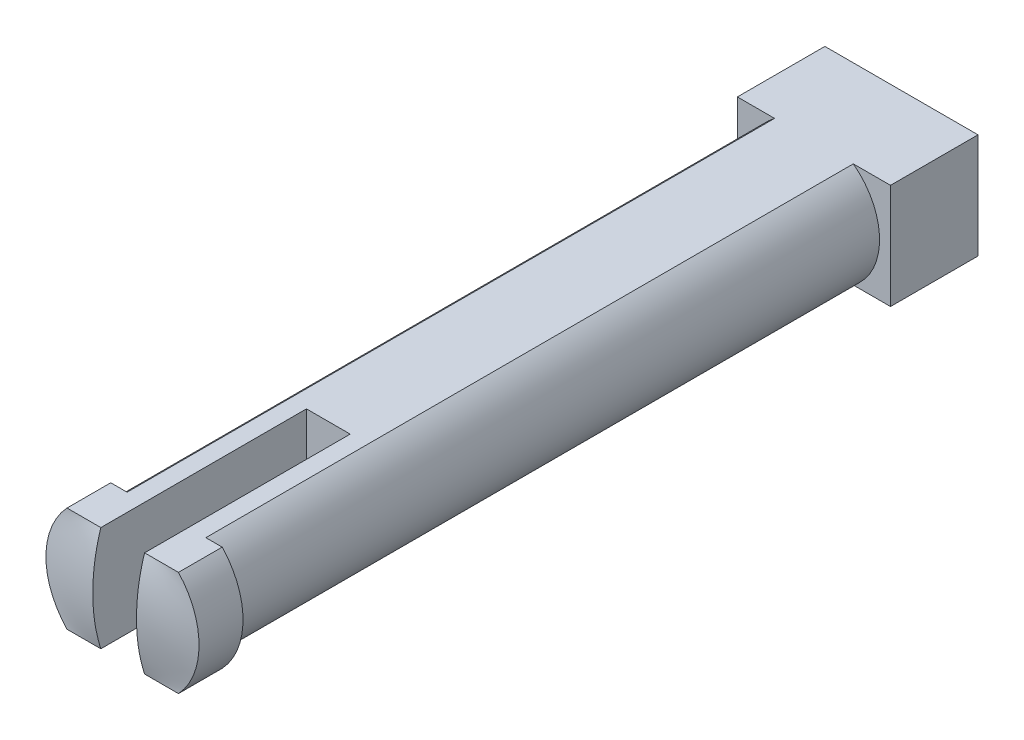
ISO-10303-21;
HEADER;
FILE_DESCRIPTION(('STEP AP214'),'2;1');
FILE_NAME('part.step','',(''),(''),'','','');
FILE_SCHEMA(('AUTOMOTIVE_DESIGN { 1 0 10303 214 1 1 1 1 }'));
ENDSEC;
DATA;
#1=APPLICATION_CONTEXT('core data for automotive mechanical design processes');
#2=APPLICATION_PROTOCOL_DEFINITION('international standard','automotive_design',2000,#1);
#3=PRODUCT_CONTEXT('',#1,'mechanical');
#4=PRODUCT('Part','Part','',(#3));
#5=PRODUCT_RELATED_PRODUCT_CATEGORY('part','',(#4));
#6=PRODUCT_DEFINITION_FORMATION('','',#4);
#7=PRODUCT_DEFINITION_CONTEXT('part definition',#1,'design');
#8=PRODUCT_DEFINITION('design','',#6,#7);
#9=PRODUCT_DEFINITION_SHAPE('','',#8);
#10=(LENGTH_UNIT() NAMED_UNIT(*) SI_UNIT(.MILLI.,.METRE.));
#11=(NAMED_UNIT(*) PLANE_ANGLE_UNIT() SI_UNIT($,.RADIAN.));
#12=(NAMED_UNIT(*) SI_UNIT($,.STERADIAN.) SOLID_ANGLE_UNIT());
#13=UNCERTAINTY_MEASURE_WITH_UNIT(LENGTH_MEASURE(1.E-05),#10,'distance_accuracy_value','');
#14=(GEOMETRIC_REPRESENTATION_CONTEXT(3) GLOBAL_UNCERTAINTY_ASSIGNED_CONTEXT((#13)) GLOBAL_UNIT_ASSIGNED_CONTEXT((#10,
#11,#12)) REPRESENTATION_CONTEXT('',''));
#15=CARTESIAN_POINT('',(0.,0.,0.));
#16=DIRECTION('',(0.,0.,1.));
#17=DIRECTION('',(1.,0.,0.));
#18=AXIS2_PLACEMENT_3D('',#15,#16,#17);
#19=CARTESIAN_POINT('',(-3.23538575752568,3.048,45.212));
#20=CARTESIAN_POINT('',(-4.93756576142003,1.2411729195063,45.212));
#21=CARTESIAN_POINT('',(-4.93756576142003,-1.2411729195063,45.212));
#22=CARTESIAN_POINT('',(-3.23538575752568,-3.048,45.212));
#23=CARTESIAN_POINT('',(-1.07846191917523,3.048,45.212));
#24=CARTESIAN_POINT('',(-1.64585525380668,1.2411729195063,46.1069422487845));
#25=CARTESIAN_POINT('',(-1.64585525380668,-1.2411729195063,46.1069422487845));
#26=CARTESIAN_POINT('',(-1.07846191917522,-3.048,45.212));
#27=CARTESIAN_POINT('',(1.07846191917522,3.048,45.212));
#28=CARTESIAN_POINT('',(1.64585525380668,1.2411729195063,46.1161220234833));
#29=CARTESIAN_POINT('',(1.64585525380668,-1.2411729195063,46.1304379233921));
#30=CARTESIAN_POINT('',(1.07846191917523,-3.048,45.212));
#31=CARTESIAN_POINT('',(3.23538575752567,3.048,45.212));
#32=CARTESIAN_POINT('',(4.93756576142003,1.2411729195063,45.212));
#33=CARTESIAN_POINT('',(4.93756576142003,-1.2411729195063,45.212));
#34=CARTESIAN_POINT('',(3.23538575752568,-3.048,45.212));
#35=B_SPLINE_SURFACE_WITH_KNOTS('',3,3,((#19,#20,#21,#22),(#23,#24,#25,#26),(#27,#28,#29,#30),
(#31,#32,#33,#34)),.UNSPECIFIED.,.F.,.F.,.F.,(4,4),(4,4),(0.,1.),(0.,1.),.UNSPECIFIED.);
#36=CARTESIAN_POINT('',(1.27,-3.048,45.212));
#37=CARTESIAN_POINT('',(1.27,-2.98361809001407,45.2326199668593));
#38=CARTESIAN_POINT('',(1.27,-2.91904839399948,45.25266091532));
#39=CARTESIAN_POINT('',(1.27,-2.78952708008224,45.2914759700286));
#40=CARTESIAN_POINT('',(1.27,-2.72457544801219,45.3102500289565));
#41=CARTESIAN_POINT('',(1.27,-2.59429304450365,45.3464197422777));
#42=CARTESIAN_POINT('',(1.27,-2.52896229852986,45.3638154881264));
#43=CARTESIAN_POINT('',(1.27,-2.39794292194821,45.3971934934623));
#44=CARTESIAN_POINT('',(1.27,-2.33225429646136,45.4131757731191));
#45=CARTESIAN_POINT('',(1.27,-2.13480759934365,45.4589507341408));
#46=CARTESIAN_POINT('',(1.27,-2.00254701375775,45.4866053736012));
#47=CARTESIAN_POINT('',(1.27,-1.73697427102654,45.5362610499949));
#48=CARTESIAN_POINT('',(1.27,-1.60366209596266,45.5582619903765));
#49=CARTESIAN_POINT('',(1.27,-1.33627003341767,45.5967470006934));
#50=CARTESIAN_POINT('',(1.27,-1.20219030398619,45.6132321675849));
#51=CARTESIAN_POINT('',(1.27,-0.933492433428468,45.6408224944221));
#52=CARTESIAN_POINT('',(1.27,-0.798874309185811,45.6519278217616));
#53=CARTESIAN_POINT('',(1.27,-0.394364696478014,45.6773568462903));
#54=CARTESIAN_POINT('',(1.27,-0.123936614210182,45.6837767714445));
#55=CARTESIAN_POINT('',(1.27,0.391924793308638,45.6762233223643));
#56=CARTESIAN_POINT('',(1.27,0.637386975211703,45.6640575217135));
#57=CARTESIAN_POINT('',(1.27,1.00445358419208,45.6327239221487));
#58=CARTESIAN_POINT('',(1.27,1.12663996829209,45.6200956361424));
#59=CARTESIAN_POINT('',(1.27,1.37047617966599,45.5903925576498));
#60=CARTESIAN_POINT('',(1.27,1.49212600998449,45.5733177904277));
#61=CARTESIAN_POINT('',(1.27,1.73488029310616,45.5346052586752));
#62=CARTESIAN_POINT('',(1.27,1.85598368859804,45.5129608597912));
#63=CARTESIAN_POINT('',(1.27,2.09727421384966,45.465047606888));
#64=CARTESIAN_POINT('',(1.27,2.21746133503228,45.4387787096347));
#65=CARTESIAN_POINT('',(1.27,2.45675866229606,45.3816005695613));
#66=CARTESIAN_POINT('',(1.27,2.5758686102808,45.3506902443101));
#67=CARTESIAN_POINT('',(1.27,2.75360135853055,45.3010192607827));
#68=CARTESIAN_POINT('',(1.27,2.8126917744405,45.2839108610813));
#69=CARTESIAN_POINT('',(1.27,2.9305697461784,45.2486871685476));
#70=CARTESIAN_POINT('',(1.27,2.98935731260786,45.2305719112265));
#71=CARTESIAN_POINT('',(1.26999999999999,3.048,45.212));
#72=B_SPLINE_CURVE_WITH_KNOTS('',3,(#36,#37,#38,#39,#40,#41,#42,#43,#44,#45,#46,#47,#48,#49,#50,
#51,#52,#53,#54,#55,#56,#57,#58,#59,#60,#61,#62,#63,#64,#65,#66,#67,#68,#69,#70,#71),
.UNSPECIFIED.,.F.,.F.,(4,2,2,2,2,2,2,2,2,2,2,2,2,2,2,2,2,4),(0.,0.202810618084034,
0.405628807216386,0.608433527402595,0.81123535317701,1.21646039679441,1.62169236022621,
2.02684368468018,2.43198240202824,3.24261833494401,3.97927779583578,4.34772038886611,
4.71616088851026,5.08514002758011,5.45412261638595,5.82319138993944,6.00773540190165,
6.19227290923324),.UNSPECIFIED.);
#73=CARTESIAN_POINT('',(1.27,-3.048,45.212));
#74=VERTEX_POINT('',#73);
#75=CARTESIAN_POINT('',(1.27,3.048,45.212));
#76=VERTEX_POINT('',#75);
#77=EDGE_CURVE('E11',#74,#76,#72,.T.);
#78=DIRECTION('',(1.,0.,0.));
#79=VECTOR('',#78,1.);
#80=CARTESIAN_POINT('',(-2.286,-3.048,45.212));
#81=LINE('',#80,#79);
#82=CARTESIAN_POINT('',(3.23538575752568,-3.048,45.212));
#83=VERTEX_POINT('',#82);
#84=EDGE_CURVE('E284',#74,#83,#81,.T.);
#85=CARTESIAN_POINT('',(3.23538575752568,-3.048,45.212));
#86=CARTESIAN_POINT('',(3.27823965773945,-3.00251143007553,45.2119963092688));
#87=CARTESIAN_POINT('',(3.32012896308464,-2.95612454625603,45.2120004010047));
#88=CARTESIAN_POINT('',(3.40191428733265,-2.86162712767124,45.2120553199218));
#89=CARTESIAN_POINT('',(3.44181034127461,-2.81351662323082,45.2121061462812));
#90=CARTESIAN_POINT('',(3.55839399517923,-2.66673275440341,45.2123754329955));
#91=CARTESIAN_POINT('',(3.63199997744291,-2.56558273122173,45.2127106658315));
#92=CARTESIAN_POINT('',(3.77036833129577,-2.35753045271942,45.2137091299192));
#93=CARTESIAN_POINT('',(3.83513703097299,-2.25063239066294,45.2143721248816));
#94=CARTESIAN_POINT('',(3.95544678975065,-2.03176223528319,45.2159186783858));
#95=CARTESIAN_POINT('',(4.01098794806118,-1.91979019652936,45.216802234556));
#96=CARTESIAN_POINT('',(4.11246550816166,-1.69152589979072,45.2186482237771));
#97=CARTESIAN_POINT('',(4.15839823374478,-1.57523200822319,45.2196106868227));
#98=CARTESIAN_POINT('',(4.24032232775613,-1.33914492891008,45.2214750696737));
#99=CARTESIAN_POINT('',(4.27631002970501,-1.21935046854298,45.2223769670576));
#100=CARTESIAN_POINT('',(4.33804757909272,-0.977224818779087,45.2240026468781));
#101=CARTESIAN_POINT('',(4.36380335254754,-0.854895141027717,45.224726532321));
#102=CARTESIAN_POINT('',(4.40493082953281,-0.608457463728968,45.2259117393006));
#103=CARTESIAN_POINT('',(4.42029892688293,-0.484348861864967,45.2263729696454));
#104=CARTESIAN_POINT('',(4.44052632716147,-0.235287030360517,45.2269815352356));
#105=CARTESIAN_POINT('',(4.44538643555344,-0.110333866194455,45.22712889454));
#106=CARTESIAN_POINT('',(4.44456559640347,0.139537795811604,45.2270943124396));
#107=CARTESIAN_POINT('',(4.43888464702079,0.264456293645543,45.2269123709774));
#108=CARTESIAN_POINT('',(4.41701665106801,0.513433288817151,45.2262390280104));
#109=CARTESIAN_POINT('',(4.40082428163367,0.637491318237383,45.2257474697228));
#110=CARTESIAN_POINT('',(4.35805131044605,0.883757630595365,45.2245101046256));
#111=CARTESIAN_POINT('',(4.33147431755537,1.0059665408299,45.2237643861532));
#112=CARTESIAN_POINT('',(4.26810734425469,1.2477626453783,45.2221071783237));
#113=CARTESIAN_POINT('',(4.23131294803843,1.36734868196028,45.221195617351));
#114=CARTESIAN_POINT('',(4.14779320136627,1.60295098963437,45.2193258984882));
#115=CARTESIAN_POINT('',(4.10107152203599,1.7189685622441,45.2183677579242));
#116=CARTESIAN_POINT('',(3.99805667979804,1.94657674210435,45.2165454723184));
#117=CARTESIAN_POINT('',(3.94177018695416,2.05817036798247,45.2156812624577));
#118=CARTESIAN_POINT('',(3.82002439453851,2.27618597128392,45.2141819636949));
#119=CARTESIAN_POINT('',(3.75456846637274,2.3826098302382,45.2135467908863));
#120=CARTESIAN_POINT('',(3.6175479892215,2.5856918230038,45.2126326546978));
#121=CARTESIAN_POINT('',(3.54630406601895,2.68256643258949,45.2123412405415));
#122=CARTESIAN_POINT('',(3.39634366066955,2.8700674014197,45.2120041030715));
#123=CARTESIAN_POINT('',(3.3176406032808,2.96070449755403,45.2119579465856));
#124=CARTESIAN_POINT('',(3.23538575752567,3.048,45.212));
#125=B_SPLINE_CURVE_WITH_KNOTS('',3,(#85,#86,#87,#88,#89,#90,#91,#92,#93,#94,#95,#96,#97,#98,
#99,#100,#101,#102,#103,#104,#105,#106,#107,#108,#109,#110,#111,#112,#113,#114,#115,#116,#117,
#118,#119,#120,#121,#122,#123,#124),.UNSPECIFIED.,.F.,.F.,(4,2,2,2,2,2,2,2,2,2,2,2,2,2,2,2,2,2,
2,4),(0.,0.187456956943611,0.374910617442542,0.749718103064126,1.12425577681104,
1.49878942344818,1.87346610641657,2.24828073949826,2.6228779739674,2.99760518672064,
3.37230367467984,3.74700222807099,4.12189067274094,4.49664895194681,4.87156944873247,
5.24635153985807,5.62087333964223,5.99525779541393,6.35561965513664,6.71534483465368),.UNSPECIFIED.);
#126=CARTESIAN_POINT('',(3.23538575752567,3.048,45.212));
#127=VERTEX_POINT('',#126);
#128=EDGE_CURVE('E212',#83,#127,#125,.T.);
#129=DIRECTION('',(-1.,0.,0.));
#130=VECTOR('',#129,1.);
#131=CARTESIAN_POINT('',(-2.286,3.048,45.212));
#132=LINE('',#131,#130);
#133=EDGE_CURVE('E161',#127,#76,#132,.T.);
#134=ORIENTED_EDGE('',*,*,#77,.F.);
#135=ORIENTED_EDGE('',*,*,#84,.T.);
#136=ORIENTED_EDGE('',*,*,#128,.T.);
#137=ORIENTED_EDGE('',*,*,#133,.T.);
#138=EDGE_LOOP('',(#134,#135,#136,#137));
#139=FACE_BOUND('',#138,.T.);
#140=ADVANCED_FACE('F38',(#139),#35,.F.);
#141=CARTESIAN_POINT('',(0.,0.,45.212));
#142=DIRECTION('',(0.,0.,-1.));
#143=DIRECTION('',(-1.,0.,0.));
#144=AXIS2_PLACEMENT_3D('',#141,#142,#143);
#145=CYLINDRICAL_SURFACE('',#144,3.81);
#146=CARTESIAN_POINT('',(0.,0.,42.672));
#147=DIRECTION('',(0.,0.,-1.));
#148=DIRECTION('',(1.,0.,0.));
#149=AXIS2_PLACEMENT_3D('',#146,#147,#148);
#150=CIRCLE('',#149,3.81);
#151=CARTESIAN_POINT('',(-2.286,-3.048,42.672));
#152=VERTEX_POINT('',#151);
#153=CARTESIAN_POINT('',(-2.286,3.048,42.672));
#154=VERTEX_POINT('',#153);
#155=EDGE_CURVE('E156',#152,#154,#150,.T.);
#156=ORIENTED_EDGE('',*,*,#155,.T.);
#157=DIRECTION('',(0.,0.,-1.));
#158=VECTOR('',#157,1.);
#159=CARTESIAN_POINT('',(-2.286,3.048,45.212));
#160=LINE('',#159,#158);
#161=CARTESIAN_POINT('',(-2.286,3.048,5.08));
#162=VERTEX_POINT('',#161);
#163=EDGE_CURVE('E151',#154,#162,#160,.T.);
#164=ORIENTED_EDGE('',*,*,#163,.T.);
#165=CARTESIAN_POINT('',(0.,0.,5.08));
#166=DIRECTION('',(0.,0.,1.));
#167=DIRECTION('',(1.,0.,0.));
#168=AXIS2_PLACEMENT_3D('',#165,#166,#167);
#169=CIRCLE('',#168,3.81);
#170=CARTESIAN_POINT('',(-2.286,-3.048,5.08));
#171=VERTEX_POINT('',#170);
#172=EDGE_CURVE('E155',#162,#171,#169,.T.);
#173=ORIENTED_EDGE('',*,*,#172,.T.);
#174=DIRECTION('',(0.,0.,-1.));
#175=VECTOR('',#174,1.);
#176=CARTESIAN_POINT('',(-2.286,-3.048,45.212));
#177=LINE('',#176,#175);
#178=EDGE_CURVE('E196',#152,#171,#177,.T.);
#179=ORIENTED_EDGE('',*,*,#178,.F.);
#180=EDGE_LOOP('',(#156,#164,#173,#179));
#181=FACE_BOUND('',#180,.T.);
#182=ADVANCED_FACE('F153',(#181),#145,.T.);
#183=CARTESIAN_POINT('',(0.,0.,5.08));
#184=DIRECTION('',(0.,0.,1.));
#185=DIRECTION('',(1.,0.,0.));
#186=AXIS2_PLACEMENT_3D('',#183,#184,#185);
#187=PLANE('',#186);
#188=ORIENTED_EDGE('',*,*,#172,.F.);
#189=DIRECTION('',(-1.,0.,0.));
#190=VECTOR('',#189,1.);
#191=CARTESIAN_POINT('',(-4.445,3.048,5.08));
#192=LINE('',#191,#190);
#193=CARTESIAN_POINT('',(-4.445,3.048,5.08));
#194=VERTEX_POINT('',#193);
#195=EDGE_CURVE('E166',#162,#194,#192,.T.);
#196=ORIENTED_EDGE('',*,*,#195,.T.);
#197=DIRECTION('',(0.,-1.,0.));
#198=VECTOR('',#197,1.);
#199=CARTESIAN_POINT('',(-4.445,3.048,5.08));
#200=LINE('',#199,#198);
#201=CARTESIAN_POINT('',(-4.445,-3.048,5.08));
#202=VERTEX_POINT('',#201);
#203=EDGE_CURVE('E182',#194,#202,#200,.T.);
#204=ORIENTED_EDGE('',*,*,#203,.T.);
#205=DIRECTION('',(1.,0.,0.));
#206=VECTOR('',#205,1.);
#207=CARTESIAN_POINT('',(-4.445,-3.048,5.08));
#208=LINE('',#207,#206);
#209=EDGE_CURVE('E169',#202,#171,#208,.T.);
#210=ORIENTED_EDGE('',*,*,#209,.T.);
#211=EDGE_LOOP('',(#188,#196,#204,#210));
#212=FACE_BOUND('',#211,.T.);
#213=ADVANCED_FACE('F165',(#212),#187,.T.);
#214=CARTESIAN_POINT('',(4.445,3.048,5.08));
#215=DIRECTION('',(-1.,0.,0.));
#216=DIRECTION('',(0.,0.,1.));
#217=AXIS2_PLACEMENT_3D('',#214,#215,#216);
#218=PLANE('',#217);
#219=DIRECTION('',(0.,1.,0.));
#220=VECTOR('',#219,1.);
#221=CARTESIAN_POINT('',(4.445,3.048,0.));
#222=LINE('',#221,#220);
#223=CARTESIAN_POINT('',(4.445,-3.048,0.));
#224=VERTEX_POINT('',#223);
#225=CARTESIAN_POINT('',(4.445,3.048,0.));
#226=VERTEX_POINT('',#225);
#227=EDGE_CURVE('E192',#224,#226,#222,.T.);
#228=ORIENTED_EDGE('',*,*,#227,.T.);
#229=DIRECTION('',(0.,0.,-1.));
#230=VECTOR('',#229,1.);
#231=CARTESIAN_POINT('',(4.445,3.048,5.08));
#232=LINE('',#231,#230);
#233=CARTESIAN_POINT('',(4.445,3.048,5.08));
#234=VERTEX_POINT('',#233);
#235=EDGE_CURVE('E207',#234,#226,#232,.T.);
#236=ORIENTED_EDGE('',*,*,#235,.F.);
#237=DIRECTION('',(0.,1.,0.));
#238=VECTOR('',#237,1.);
#239=CARTESIAN_POINT('',(4.445,3.048,5.08));
#240=LINE('',#239,#238);
#241=CARTESIAN_POINT('',(4.445,-3.048,5.08));
#242=VERTEX_POINT('',#241);
#243=EDGE_CURVE('E179',#242,#234,#240,.T.);
#244=ORIENTED_EDGE('',*,*,#243,.F.);
#245=DIRECTION('',(0.,0.,-1.));
#246=VECTOR('',#245,1.);
#247=CARTESIAN_POINT('',(4.445,-3.048,5.08));
#248=LINE('',#247,#246);
#249=EDGE_CURVE('E191',#242,#224,#248,.T.);
#250=ORIENTED_EDGE('',*,*,#249,.T.);
#251=EDGE_LOOP('',(#228,#236,#244,#250));
#252=FACE_BOUND('',#251,.T.);
#253=ADVANCED_FACE('F363',(#252),#218,.F.);
#254=CARTESIAN_POINT('',(-4.445,3.048,5.08));
#255=DIRECTION('',(0.,-1.,0.));
#256=DIRECTION('',(0.,0.,-1.));
#257=AXIS2_PLACEMENT_3D('',#254,#255,#256);
#258=PLANE('',#257);
#259=DIRECTION('',(-1.,0.,0.));
#260=VECTOR('',#259,1.);
#261=CARTESIAN_POINT('',(-1.27,3.048,33.274));
#262=LINE('',#261,#260);
#263=CARTESIAN_POINT('',(1.27,3.048,33.274));
#264=VERTEX_POINT('',#263);
#265=CARTESIAN_POINT('',(-1.27,3.048,33.274));
#266=VERTEX_POINT('',#265);
#267=EDGE_CURVE('E331',#264,#266,#262,.T.);
#268=ORIENTED_EDGE('',*,*,#267,.F.);
#269=DIRECTION('',(0.,0.,-1.));
#270=VECTOR('',#269,1.);
#271=CARTESIAN_POINT('',(1.27,3.048,33.274));
#272=LINE('',#271,#270);
#273=EDGE_CURVE('E334',#76,#264,#272,.T.);
#274=ORIENTED_EDGE('',*,*,#273,.F.);
#275=ORIENTED_EDGE('',*,*,#133,.F.);
#276=DIRECTION('',(0.,0.,1.));
#277=VECTOR('',#276,1.);
#278=CARTESIAN_POINT('',(3.23538575752567,3.048,42.672));
#279=LINE('',#278,#277);
#280=CARTESIAN_POINT('',(3.23538575752567,3.048,42.672));
#281=VERTEX_POINT('',#280);
#282=EDGE_CURVE('E246',#281,#127,#279,.T.);
#283=ORIENTED_EDGE('',*,*,#282,.F.);
#284=DIRECTION('',(-1.,0.,0.));
#285=VECTOR('',#284,1.);
#286=CARTESIAN_POINT('',(3.23538575752567,3.048,42.672));
#287=LINE('',#286,#285);
#288=CARTESIAN_POINT('',(2.286,3.048,42.672));
#289=VERTEX_POINT('',#288);
#290=EDGE_CURVE('E310',#281,#289,#287,.T.);
#291=ORIENTED_EDGE('',*,*,#290,.T.);
#292=DIRECTION('',(0.,0.,-1.));
#293=VECTOR('',#292,1.);
#294=CARTESIAN_POINT('',(2.286,3.048,45.212));
#295=LINE('',#294,#293);
#296=CARTESIAN_POINT('',(2.286,3.048,5.08));
#297=VERTEX_POINT('',#296);
#298=EDGE_CURVE('E160',#289,#297,#295,.T.);
#299=ORIENTED_EDGE('',*,*,#298,.T.);
#300=EDGE_CURVE('E178',#234,#297,#192,.T.);
#301=ORIENTED_EDGE('',*,*,#300,.F.);
#302=ORIENTED_EDGE('',*,*,#235,.T.);
#303=DIRECTION('',(-1.,0.,0.));
#304=VECTOR('',#303,1.);
#305=CARTESIAN_POINT('',(-4.445,3.048,0.));
#306=LINE('',#305,#304);
#307=CARTESIAN_POINT('',(-4.445,3.048,0.));
#308=VERTEX_POINT('',#307);
#309=EDGE_CURVE('E195',#226,#308,#306,.T.);
#310=ORIENTED_EDGE('',*,*,#309,.T.);
#311=DIRECTION('',(0.,0.,-1.));
#312=VECTOR('',#311,1.);
#313=CARTESIAN_POINT('',(-4.445,3.048,5.08));
#314=LINE('',#313,#312);
#315=EDGE_CURVE('E176',#194,#308,#314,.T.);
#316=ORIENTED_EDGE('',*,*,#315,.F.);
#317=ORIENTED_EDGE('',*,*,#195,.F.);
#318=ORIENTED_EDGE('',*,*,#163,.F.);
#319=DIRECTION('',(-1.,0.,0.));
#320=VECTOR('',#319,1.);
#321=CARTESIAN_POINT('',(-3.23538575752568,3.048,42.672));
#322=LINE('',#321,#320);
#323=CARTESIAN_POINT('',(-3.23538575752568,3.048,42.672));
#324=VERTEX_POINT('',#323);
#325=EDGE_CURVE('E302',#154,#324,#322,.T.);
#326=ORIENTED_EDGE('',*,*,#325,.T.);
#327=DIRECTION('',(0.,0.,1.));
#328=VECTOR('',#327,1.);
#329=CARTESIAN_POINT('',(-3.23538575752568,3.048,42.672));
#330=LINE('',#329,#328);
#331=CARTESIAN_POINT('',(-3.23538575752568,3.048,45.212));
#332=VERTEX_POINT('',#331);
#333=EDGE_CURVE('E282',#324,#332,#330,.T.);
#334=ORIENTED_EDGE('',*,*,#333,.T.);
#335=CARTESIAN_POINT('',(-1.27,3.048,45.212));
#336=VERTEX_POINT('',#335);
#337=EDGE_CURVE('E94',#336,#332,#132,.T.);
#338=ORIENTED_EDGE('',*,*,#337,.F.);
#339=DIRECTION('',(0.,0.,1.));
#340=VECTOR('',#339,1.);
#341=CARTESIAN_POINT('',(-1.27,3.048,33.274));
#342=LINE('',#341,#340);
#343=EDGE_CURVE('E61',#266,#336,#342,.T.);
#344=ORIENTED_EDGE('',*,*,#343,.F.);
#345=EDGE_LOOP('',(#268,#274,#275,#283,#291,#299,#301,#302,#310,#316,#317,#318,#326,#334,#338,#344));
#346=FACE_BOUND('',#345,.T.);
#347=ADVANCED_FACE('F174',(#346),#258,.F.);
#348=CARTESIAN_POINT('',(-4.445,3.048,5.08));
#349=DIRECTION('',(1.,0.,0.));
#350=DIRECTION('',(0.,1.,0.));
#351=AXIS2_PLACEMENT_3D('',#348,#349,#350);
#352=PLANE('',#351);
#353=DIRECTION('',(0.,-1.,0.));
#354=VECTOR('',#353,1.);
#355=CARTESIAN_POINT('',(-4.445,3.048,0.));
#356=LINE('',#355,#354);
#357=CARTESIAN_POINT('',(-4.445,-3.048,0.));
#358=VERTEX_POINT('',#357);
#359=EDGE_CURVE('E198',#308,#358,#356,.T.);
#360=ORIENTED_EDGE('',*,*,#359,.T.);
#361=DIRECTION('',(0.,0.,-1.));
#362=VECTOR('',#361,1.);
#363=CARTESIAN_POINT('',(-4.445,-3.048,5.08));
#364=LINE('',#363,#362);
#365=EDGE_CURVE('E203',#202,#358,#364,.T.);
#366=ORIENTED_EDGE('',*,*,#365,.F.);
#367=ORIENTED_EDGE('',*,*,#203,.F.);
#368=ORIENTED_EDGE('',*,*,#315,.T.);
#369=EDGE_LOOP('',(#360,#366,#367,#368));
#370=FACE_BOUND('',#369,.T.);
#371=ADVANCED_FACE('F369',(#370),#352,.F.);
#372=CARTESIAN_POINT('',(-4.445,-3.048,5.08));
#373=DIRECTION('',(0.,1.,0.));
#374=DIRECTION('',(0.,0.,1.));
#375=AXIS2_PLACEMENT_3D('',#372,#373,#374);
#376=PLANE('',#375);
#377=ORIENTED_EDGE('',*,*,#84,.F.);
#378=DIRECTION('',(0.,0.,1.));
#379=VECTOR('',#378,1.);
#380=CARTESIAN_POINT('',(1.27,-3.048,33.274));
#381=LINE('',#380,#379);
#382=CARTESIAN_POINT('',(1.27,-3.048,33.274));
#383=VERTEX_POINT('',#382);
#384=EDGE_CURVE('E323',#383,#74,#381,.T.);
#385=ORIENTED_EDGE('',*,*,#384,.F.);
#386=DIRECTION('',(1.,0.,0.));
#387=VECTOR('',#386,1.);
#388=CARTESIAN_POINT('',(-1.27,-3.048,33.274));
#389=LINE('',#388,#387);
#390=CARTESIAN_POINT('',(-1.27,-3.048,33.274));
#391=VERTEX_POINT('',#390);
#392=EDGE_CURVE('E220',#391,#383,#389,.T.);
#393=ORIENTED_EDGE('',*,*,#392,.F.);
#394=DIRECTION('',(0.,0.,-1.));
#395=VECTOR('',#394,1.);
#396=CARTESIAN_POINT('',(-1.27,-3.048,33.274));
#397=LINE('',#396,#395);
#398=CARTESIAN_POINT('',(-1.27,-3.048,45.212));
#399=VERTEX_POINT('',#398);
#400=EDGE_CURVE('E329',#399,#391,#397,.T.);
#401=ORIENTED_EDGE('',*,*,#400,.F.);
#402=CARTESIAN_POINT('',(-3.23538575752568,-3.048,45.212));
#403=VERTEX_POINT('',#402);
#404=EDGE_CURVE('E221',#403,#399,#81,.T.);
#405=ORIENTED_EDGE('',*,*,#404,.F.);
#406=DIRECTION('',(0.,0.,1.));
#407=VECTOR('',#406,1.);
#408=CARTESIAN_POINT('',(-3.23538575752568,-3.048,42.672));
#409=LINE('',#408,#407);
#410=CARTESIAN_POINT('',(-3.23538575752568,-3.048,42.672));
#411=VERTEX_POINT('',#410);
#412=EDGE_CURVE('E171',#411,#403,#409,.T.);
#413=ORIENTED_EDGE('',*,*,#412,.F.);
#414=DIRECTION('',(1.,0.,0.));
#415=VECTOR('',#414,1.);
#416=CARTESIAN_POINT('',(-2.286,-3.048,42.672));
#417=LINE('',#416,#415);
#418=EDGE_CURVE('E296',#411,#152,#417,.T.);
#419=ORIENTED_EDGE('',*,*,#418,.T.);
#420=ORIENTED_EDGE('',*,*,#178,.T.);
#421=ORIENTED_EDGE('',*,*,#209,.F.);
#422=ORIENTED_EDGE('',*,*,#365,.T.);
#423=DIRECTION('',(1.,0.,0.));
#424=VECTOR('',#423,1.);
#425=CARTESIAN_POINT('',(-4.445,-3.048,0.));
#426=LINE('',#425,#424);
#427=EDGE_CURVE('E184',#358,#224,#426,.T.);
#428=ORIENTED_EDGE('',*,*,#427,.T.);
#429=ORIENTED_EDGE('',*,*,#249,.F.);
#430=CARTESIAN_POINT('',(2.286,-3.048,5.08));
#431=VERTEX_POINT('',#430);
#432=EDGE_CURVE('E189',#431,#242,#208,.T.);
#433=ORIENTED_EDGE('',*,*,#432,.F.);
#434=DIRECTION('',(0.,0.,-1.));
#435=VECTOR('',#434,1.);
#436=CARTESIAN_POINT('',(2.286,-3.048,45.212));
#437=LINE('',#436,#435);
#438=CARTESIAN_POINT('',(2.286,-3.048,42.672));
#439=VERTEX_POINT('',#438);
#440=EDGE_CURVE('E70',#439,#431,#437,.T.);
#441=ORIENTED_EDGE('',*,*,#440,.F.);
#442=DIRECTION('',(1.,0.,0.));
#443=VECTOR('',#442,1.);
#444=CARTESIAN_POINT('',(2.286,-3.048,42.672));
#445=LINE('',#444,#443);
#446=CARTESIAN_POINT('',(3.23538575752568,-3.048,42.672));
#447=VERTEX_POINT('',#446);
#448=EDGE_CURVE('E317',#439,#447,#445,.T.);
#449=ORIENTED_EDGE('',*,*,#448,.T.);
#450=DIRECTION('',(0.,0.,1.));
#451=VECTOR('',#450,1.);
#452=CARTESIAN_POINT('',(3.23538575752568,-3.048,42.672));
#453=LINE('',#452,#451);
#454=EDGE_CURVE('E308',#447,#83,#453,.T.);
#455=ORIENTED_EDGE('',*,*,#454,.T.);
#456=EDGE_LOOP('',(#377,#385,#393,#401,#405,#413,#419,#420,#421,#422,#428,#429,#433,#441,#449,#455));
#457=FACE_BOUND('',#456,.T.);
#458=ADVANCED_FACE('F294',(#457),#376,.F.);
#459=CARTESIAN_POINT('',(0.,0.,5.08));
#460=DIRECTION('',(0.,0.,1.));
#461=DIRECTION('',(-1.,0.,0.));
#462=AXIS2_PLACEMENT_3D('',#459,#460,#461);
#463=CIRCLE('',#462,3.81);
#464=EDGE_CURVE('E170',#431,#297,#463,.T.);
#465=ORIENTED_EDGE('',*,*,#464,.F.);
#466=ORIENTED_EDGE('',*,*,#432,.T.);
#467=ORIENTED_EDGE('',*,*,#243,.T.);
#468=ORIENTED_EDGE('',*,*,#300,.T.);
#469=EDGE_LOOP('',(#465,#466,#467,#468));
#470=FACE_BOUND('',#469,.T.);
#471=ADVANCED_FACE('F359',(#470),#187,.T.);
#472=CARTESIAN_POINT('',(0.,0.,0.));
#473=DIRECTION('',(0.,0.,1.));
#474=DIRECTION('',(1.,0.,0.));
#475=AXIS2_PLACEMENT_3D('',#472,#473,#474);
#476=PLANE('',#475);
#477=ORIENTED_EDGE('',*,*,#227,.F.);
#478=ORIENTED_EDGE('',*,*,#427,.F.);
#479=ORIENTED_EDGE('',*,*,#359,.F.);
#480=ORIENTED_EDGE('',*,*,#309,.F.);
#481=EDGE_LOOP('',(#477,#478,#479,#480));
#482=FACE_BOUND('',#481,.T.);
#483=ADVANCED_FACE('F276',(#482),#476,.F.);
#484=CARTESIAN_POINT('',(0.,0.,45.212));
#485=DIRECTION('',(0.,0.,-1.));
#486=DIRECTION('',(-1.,0.,0.));
#487=AXIS2_PLACEMENT_3D('',#484,#485,#486);
#488=CYLINDRICAL_SURFACE('',#487,3.81);
#489=ORIENTED_EDGE('',*,*,#298,.F.);
#490=CARTESIAN_POINT('',(0.,0.,42.672));
#491=DIRECTION('',(0.,0.,-1.));
#492=DIRECTION('',(-1.,0.,0.));
#493=AXIS2_PLACEMENT_3D('',#490,#491,#492);
#494=CIRCLE('',#493,3.81);
#495=EDGE_CURVE('E102',#289,#439,#494,.T.);
#496=ORIENTED_EDGE('',*,*,#495,.T.);
#497=ORIENTED_EDGE('',*,*,#440,.T.);
#498=ORIENTED_EDGE('',*,*,#464,.T.);
#499=EDGE_LOOP('',(#489,#496,#497,#498));
#500=FACE_BOUND('',#499,.T.);
#501=ADVANCED_FACE('F239',(#500),#488,.T.);
#502=CARTESIAN_POINT('',(-1.27,3.048,45.212));
#503=CARTESIAN_POINT('',(-1.27,2.98203124521122,45.2328149460686));
#504=CARTESIAN_POINT('',(-1.27,2.91587578407752,45.2530461828954));
#505=CARTESIAN_POINT('',(-1.27,2.78318278282758,45.2922231661892));
#506=CARTESIAN_POINT('',(-1.27,2.71664522728038,45.3111688603377));
#507=CARTESIAN_POINT('',(-1.27,2.58318817409604,45.3476540339826));
#508=CARTESIAN_POINT('',(-1.27,2.51626869631251,45.3651935858745));
#509=CARTESIAN_POINT('',(-1.27,2.38206986164432,45.3988274119555));
#510=CARTESIAN_POINT('',(-1.27,2.31479051036424,45.4149217085836));
#511=CARTESIAN_POINT('',(-1.27,2.1125393788911,45.4609883024284));
#512=CARTESIAN_POINT('',(-1.27,1.97706151679806,45.4887697763192));
#513=CARTESIAN_POINT('',(-1.27,1.70505005645874,45.5385273701221));
#514=CARTESIAN_POINT('',(-1.27,1.56851644512515,45.5605034179496));
#515=CARTESIAN_POINT('',(-1.27,1.29467155249225,45.5987780509824));
#516=CARTESIAN_POINT('',(-1.27,1.15736036997723,45.6150773416292));
#517=CARTESIAN_POINT('',(-1.27,0.882207156643632,45.6421196496817));
#518=CARTESIAN_POINT('',(-1.27,0.744365140632938,45.6528628209634));
#519=CARTESIAN_POINT('',(-1.27,0.330235651944658,45.676913089272));
#520=CARTESIAN_POINT('',(-1.27,0.0534225754940399,45.6820302112896));
#521=CARTESIAN_POINT('',(-1.27,-0.462284065793118,45.6713408563112));
#522=CARTESIAN_POINT('',(-1.27,-0.701243889466461,45.6582700216338));
#523=CARTESIAN_POINT('',(-1.27,-1.1776890281562,45.6154871492479));
#524=CARTESIAN_POINT('',(-1.27,-1.41517457156323,45.5857777576415));
#525=CARTESIAN_POINT('',(-1.27,-1.76947561339685,45.5281812269822));
#526=CARTESIAN_POINT('',(-1.27,-1.88737620474906,45.5067812852328));
#527=CARTESIAN_POINT('',(-1.27,-2.12227295629947,45.4595594021083));
#528=CARTESIAN_POINT('',(-1.27,-2.23926927464473,45.4337382531189));
#529=CARTESIAN_POINT('',(-1.27,-2.47223063510996,45.3776604832538));
#530=CARTESIAN_POINT('',(-1.27,-2.58819536662754,45.3474025714557));
#531=CARTESIAN_POINT('',(-1.27,-2.76126175486993,45.298860331554));
#532=CARTESIAN_POINT('',(-1.27,-2.81881062569609,45.2821514929692));
#533=CARTESIAN_POINT('',(-1.27,-2.93361908369456,45.2477735213926));
#534=CARTESIAN_POINT('',(-1.27,-2.99087868003879,45.2301044190591));
#535=CARTESIAN_POINT('',(-1.26999999999999,-3.048,45.212));
#536=B_SPLINE_CURVE_WITH_KNOTS('',3,(#502,#503,#504,#505,#506,#507,#508,#509,#510,#511,#512,
#513,#514,#515,#516,#517,#518,#519,#520,#521,#522,#523,#524,#525,#526,#527,#528,#529,#530,#531,
#532,#533,#534,#535),.UNSPECIFIED.,.F.,.F.,(4,2,2,2,2,2,2,2,2,2,2,2,2,2,2,2,4),(0.,
0.207524950812671,0.415058342335185,0.622581042079112,0.830100519260874,1.24485042980363,
1.65960548995609,2.07430899074614,2.48900100576718,3.31862010067444,4.03606162501122,
4.75338908388799,5.11280022161552,5.47214701160144,5.83159856553285,6.01136753371633,
6.1911307657983),.UNSPECIFIED.);
#537=EDGE_CURVE('E54',#336,#399,#536,.T.);
#538=CARTESIAN_POINT('',(-3.23538575752568,3.048,45.212));
#539=CARTESIAN_POINT('',(-3.27823992802996,3.00251114314864,45.2119964134002));
#540=CARTESIAN_POINT('',(-3.32012949097778,2.95612396170064,45.2120003899008));
#541=CARTESIAN_POINT('',(-3.40191589176867,2.86162524845704,45.2120539287195));
#542=CARTESIAN_POINT('',(-3.44181273609163,2.81351372226952,45.2121034908894));
#543=CARTESIAN_POINT('',(-3.55839809627275,2.66672736272538,45.2123661970618));
#544=CARTESIAN_POINT('',(-3.63200492541012,2.56557581248672,45.21269332549));
#545=CARTESIAN_POINT('',(-3.77037471797007,2.3575203287024,45.2136686230462));
#546=CARTESIAN_POINT('',(-3.83514401318335,2.25062059090617,45.2143165607684));
#547=CARTESIAN_POINT('',(-3.95545470599086,2.03174693148781,45.2158293460273));
#548=CARTESIAN_POINT('',(-4.01099620350414,1.9197730648253,45.2166941912152));
#549=CARTESIAN_POINT('',(-4.11247393699446,1.69150550090871,45.2185027287491));
#550=CARTESIAN_POINT('',(-4.15840653703519,1.57521018798211,45.2194464507532));
#551=CARTESIAN_POINT('',(-4.24033014937244,1.33912027959763,45.2212763789474));
#552=CARTESIAN_POINT('',(-4.27631749498847,1.21932441148364,45.2221625638324));
#553=CARTESIAN_POINT('',(-4.33805411120852,0.977195981198171,45.2237619473511));
#554=CARTESIAN_POINT('',(-4.36380930522765,0.854864929936209,45.2244752459754));
#555=CARTESIAN_POINT('',(-4.40493540752748,0.608424571277992,45.2256454611128));
#556=CARTESIAN_POINT('',(-4.42030270776828,0.484314661297525,45.2261022885361));
#557=CARTESIAN_POINT('',(-4.44052826370578,0.235250829166491,45.2267083871687));
#558=CARTESIAN_POINT('',(-4.44538736944149,0.11029697610532,45.2268576832551));
#559=CARTESIAN_POINT('',(-4.44456441555189,-0.139575987240436,45.2268327008392));
#560=CARTESIAN_POINT('',(-4.43888235419981,-0.264495097519325,45.2266584222839));
#561=CARTESIAN_POINT('',(-4.4170120283203,-0.51347321137121,45.2260049213913));
#562=CARTESIAN_POINT('',(-4.40081844434411,-0.637531747298744,45.2255255446586));
#563=CARTESIAN_POINT('',(-4.35804294079162,-0.883798998408144,45.2243154083815));
#564=CARTESIAN_POINT('',(-4.33146463012712,-1.00600834091476,45.223584736178));
#565=CARTESIAN_POINT('',(-4.26809473635523,-1.24780591614628,45.2219585931212));
#566=CARTESIAN_POINT('',(-4.23129867755611,-1.36739297540478,45.2210630501074));
#567=CARTESIAN_POINT('',(-4.14777541111708,-1.60299713678463,45.219224370457));
#568=CARTESIAN_POINT('',(-4.10105187463809,-1.71901554048136,45.2182812515121));
#569=CARTESIAN_POINT('',(-3.99803315393394,-1.94662515494013,45.2164862011722));
#570=CARTESIAN_POINT('',(-3.94174463850184,-2.058219383874,45.2156342069142));
#571=CARTESIAN_POINT('',(-3.8199946785017,-2.27623591938041,45.2141552354586));
#572=CARTESIAN_POINT('',(-3.75453660551592,-2.3826601076567,45.2135281758547));
#573=CARTESIAN_POINT('',(-3.61751823262552,-2.58573298511237,45.2126254179007));
#574=CARTESIAN_POINT('',(-3.54627933115005,-2.68259868004569,45.212337411092));
#575=CARTESIAN_POINT('',(-3.39633031804852,-2.87008276321885,45.2120040858486));
#576=CARTESIAN_POINT('',(-3.31763363186121,-2.96071188906358,45.2119583394396));
#577=CARTESIAN_POINT('',(-3.23538575752568,-3.048,45.212));
#578=B_SPLINE_CURVE_WITH_KNOTS('',3,(#538,#539,#540,#541,#542,#543,#544,#545,#546,#547,#548,
#549,#550,#551,#552,#553,#554,#555,#556,#557,#558,#559,#560,#561,#562,#563,#564,#565,#566,#567,
#568,#569,#570,#571,#572,#573,#574,#575,#576,#577),.UNSPECIFIED.,.F.,.F.,(4,2,2,2,2,2,2,2,2,2,2,
2,2,2,2,2,2,2,2,4),(0.,0.187458137943976,0.374915666273268,0.749728288823996,1.12427094483189,
1.49880954500864,1.8734896125157,2.24830763575006,2.62290835872031,2.99763912545782,
3.37233957797855,3.74704009187992,4.12193037426867,4.49669049008064,4.87161502214077,
5.24640114843567,5.62092703447721,5.9953155696786,6.35564704675707,6.71534175363706),.UNSPECIFIED.);
#579=EDGE_CURVE('E241',#332,#403,#578,.T.);
#580=ORIENTED_EDGE('',*,*,#537,.F.);
#581=ORIENTED_EDGE('',*,*,#337,.T.);
#582=ORIENTED_EDGE('',*,*,#579,.T.);
#583=ORIENTED_EDGE('',*,*,#404,.T.);
#584=EDGE_LOOP('',(#580,#581,#582,#583));
#585=FACE_BOUND('',#584,.T.);
#586=ADVANCED_FACE('F40',(#585),#35,.F.);
#587=CARTESIAN_POINT('',(0.,0.,42.672));
#588=DIRECTION('',(0.,0.,1.));
#589=DIRECTION('',(1.,0.,0.));
#590=AXIS2_PLACEMENT_3D('',#587,#588,#589);
#591=CYLINDRICAL_SURFACE('',#590,4.445);
#592=ORIENTED_EDGE('',*,*,#579,.F.);
#593=ORIENTED_EDGE('',*,*,#333,.F.);
#594=CARTESIAN_POINT('',(0.,0.,42.672));
#595=DIRECTION('',(0.,0.,1.));
#596=DIRECTION('',(-1.,0.,0.));
#597=AXIS2_PLACEMENT_3D('',#594,#595,#596);
#598=CIRCLE('',#597,4.445);
#599=EDGE_CURVE('E300',#324,#411,#598,.T.);
#600=ORIENTED_EDGE('',*,*,#599,.T.);
#601=ORIENTED_EDGE('',*,*,#412,.T.);
#602=EDGE_LOOP('',(#592,#593,#600,#601));
#603=FACE_BOUND('',#602,.T.);
#604=ADVANCED_FACE('F233',(#603),#591,.T.);
#605=CARTESIAN_POINT('',(0.,0.,42.672));
#606=DIRECTION('',(0.,0.,1.));
#607=DIRECTION('',(1.,0.,0.));
#608=AXIS2_PLACEMENT_3D('',#605,#606,#607);
#609=PLANE('',#608);
#610=ORIENTED_EDGE('',*,*,#155,.F.);
#611=ORIENTED_EDGE('',*,*,#418,.F.);
#612=ORIENTED_EDGE('',*,*,#599,.F.);
#613=ORIENTED_EDGE('',*,*,#325,.F.);
#614=EDGE_LOOP('',(#610,#611,#612,#613));
#615=FACE_BOUND('',#614,.T.);
#616=ADVANCED_FACE('F229',(#615),#609,.F.);
#617=CARTESIAN_POINT('',(0.,0.,42.672));
#618=DIRECTION('',(0.,0.,1.));
#619=DIRECTION('',(1.,0.,0.));
#620=AXIS2_PLACEMENT_3D('',#617,#618,#619);
#621=CYLINDRICAL_SURFACE('',#620,4.445);
#622=ORIENTED_EDGE('',*,*,#128,.F.);
#623=ORIENTED_EDGE('',*,*,#454,.F.);
#624=CARTESIAN_POINT('',(0.,0.,42.672));
#625=DIRECTION('',(0.,0.,1.));
#626=DIRECTION('',(1.,0.,0.));
#627=AXIS2_PLACEMENT_3D('',#624,#625,#626);
#628=CIRCLE('',#627,4.445);
#629=EDGE_CURVE('E314',#447,#281,#628,.T.);
#630=ORIENTED_EDGE('',*,*,#629,.T.);
#631=ORIENTED_EDGE('',*,*,#282,.T.);
#632=EDGE_LOOP('',(#622,#623,#630,#631));
#633=FACE_BOUND('',#632,.T.);
#634=ADVANCED_FACE('F223',(#633),#621,.T.);
#635=CARTESIAN_POINT('',(0.,0.,42.672));
#636=DIRECTION('',(0.,0.,-1.));
#637=DIRECTION('',(-1.,0.,0.));
#638=AXIS2_PLACEMENT_3D('',#635,#636,#637);
#639=PLANE('',#638);
#640=ORIENTED_EDGE('',*,*,#495,.F.);
#641=ORIENTED_EDGE('',*,*,#290,.F.);
#642=ORIENTED_EDGE('',*,*,#629,.F.);
#643=ORIENTED_EDGE('',*,*,#448,.F.);
#644=EDGE_LOOP('',(#640,#641,#642,#643));
#645=FACE_BOUND('',#644,.T.);
#646=ADVANCED_FACE('F228',(#645),#639,.T.);
#647=CARTESIAN_POINT('',(1.27,-15.7505442756811,33.274));
#648=DIRECTION('',(1.,0.,0.));
#649=DIRECTION('',(0.,0.,-1.));
#650=AXIS2_PLACEMENT_3D('',#647,#648,#649);
#651=PLANE('',#650);
#652=ORIENTED_EDGE('',*,*,#77,.T.);
#653=ORIENTED_EDGE('',*,*,#273,.T.);
#654=DIRECTION('',(0.,1.,0.));
#655=VECTOR('',#654,1.);
#656=CARTESIAN_POINT('',(1.27,-15.7505442756811,33.274));
#657=LINE('',#656,#655);
#658=EDGE_CURVE('E324',#383,#264,#657,.T.);
#659=ORIENTED_EDGE('',*,*,#658,.F.);
#660=ORIENTED_EDGE('',*,*,#384,.T.);
#661=EDGE_LOOP('',(#652,#653,#659,#660));
#662=FACE_BOUND('',#661,.T.);
#663=ADVANCED_FACE('F257',(#662),#651,.F.);
#664=CARTESIAN_POINT('',(-1.27,-15.7505442756811,33.274));
#665=DIRECTION('',(-1.,0.,0.));
#666=DIRECTION('',(0.,0.,1.));
#667=AXIS2_PLACEMENT_3D('',#664,#665,#666);
#668=PLANE('',#667);
#669=ORIENTED_EDGE('',*,*,#537,.T.);
#670=ORIENTED_EDGE('',*,*,#400,.T.);
#671=DIRECTION('',(0.,1.,0.));
#672=VECTOR('',#671,1.);
#673=CARTESIAN_POINT('',(-1.27,-15.7505442756811,33.274));
#674=LINE('',#673,#672);
#675=EDGE_CURVE('E327',#391,#266,#674,.T.);
#676=ORIENTED_EDGE('',*,*,#675,.T.);
#677=ORIENTED_EDGE('',*,*,#343,.T.);
#678=EDGE_LOOP('',(#669,#670,#676,#677));
#679=FACE_BOUND('',#678,.T.);
#680=ADVANCED_FACE('F252',(#679),#668,.F.);
#681=CARTESIAN_POINT('',(-1.27,-15.7505442756811,33.274));
#682=DIRECTION('',(0.,0.,-1.));
#683=DIRECTION('',(-1.,0.,0.));
#684=AXIS2_PLACEMENT_3D('',#681,#682,#683);
#685=PLANE('',#684);
#686=ORIENTED_EDGE('',*,*,#392,.T.);
#687=ORIENTED_EDGE('',*,*,#658,.T.);
#688=ORIENTED_EDGE('',*,*,#267,.T.);
#689=ORIENTED_EDGE('',*,*,#675,.F.);
#690=EDGE_LOOP('',(#686,#687,#688,#689));
#691=FACE_BOUND('',#690,.T.);
#692=ADVANCED_FACE('F256',(#691),#685,.F.);
#693=CLOSED_SHELL('',(#140,#182,#213,#253,#347,#371,#458,#471,#483,#501,#586,#604,#616,#634,
#646,#663,#680,#692));
#694=MANIFOLD_SOLID_BREP('B2',#693);
#695=ADVANCED_BREP_SHAPE_REPRESENTATION('',(#18,#694),#14);
#696=SHAPE_DEFINITION_REPRESENTATION(#9,#695);
ENDSEC;
END-ISO-10303-21;
